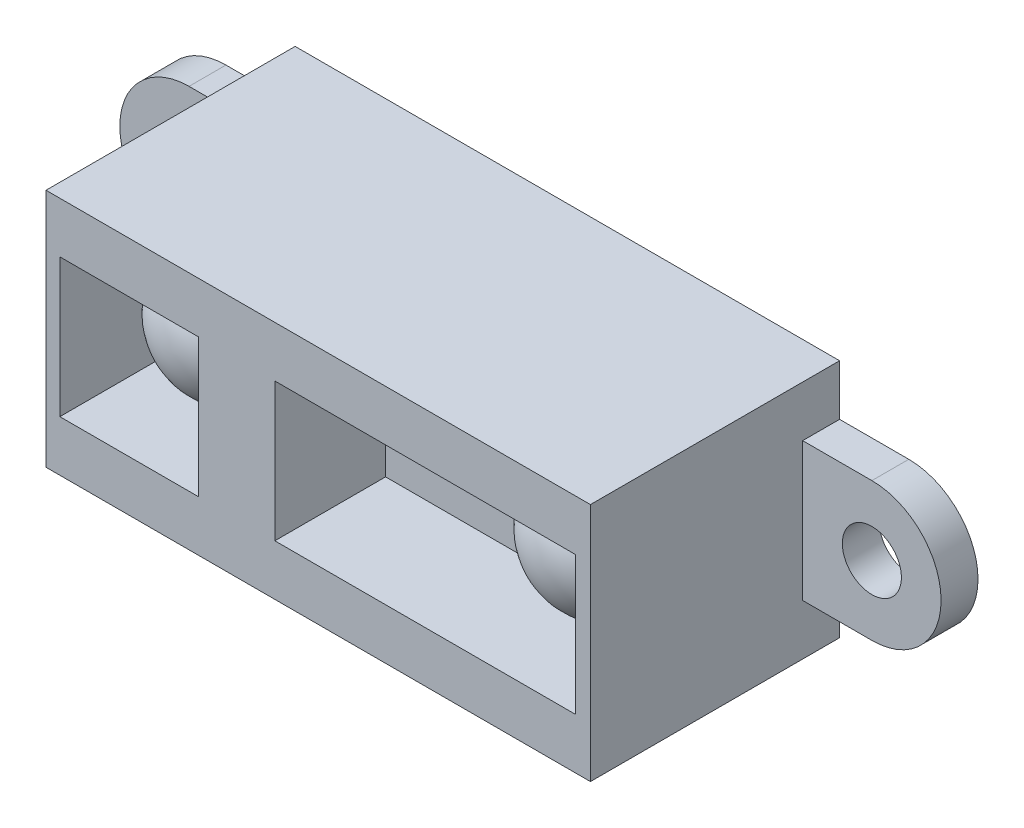
ISO-10303-21;
HEADER;
FILE_DESCRIPTION(('STEP AP214'),'2;1');
FILE_NAME('part.step','',(''),(''),'','','');
FILE_SCHEMA(('AUTOMOTIVE_DESIGN { 1 0 10303 214 1 1 1 1 }'));
ENDSEC;
DATA;
#1=APPLICATION_CONTEXT('core data for automotive mechanical design processes');
#2=APPLICATION_PROTOCOL_DEFINITION('international standard','automotive_design',2000,#1);
#3=PRODUCT_CONTEXT('',#1,'mechanical');
#4=PRODUCT('Part','Part','',(#3));
#5=PRODUCT_RELATED_PRODUCT_CATEGORY('part','',(#4));
#6=PRODUCT_DEFINITION_FORMATION('','',#4);
#7=PRODUCT_DEFINITION_CONTEXT('part definition',#1,'design');
#8=PRODUCT_DEFINITION('design','',#6,#7);
#9=PRODUCT_DEFINITION_SHAPE('','',#8);
#10=(LENGTH_UNIT() NAMED_UNIT(*) SI_UNIT(.MILLI.,.METRE.));
#11=(NAMED_UNIT(*) PLANE_ANGLE_UNIT() SI_UNIT($,.RADIAN.));
#12=(NAMED_UNIT(*) SI_UNIT($,.STERADIAN.) SOLID_ANGLE_UNIT());
#13=UNCERTAINTY_MEASURE_WITH_UNIT(LENGTH_MEASURE(1.E-05),#10,'distance_accuracy_value','');
#14=(GEOMETRIC_REPRESENTATION_CONTEXT(3) GLOBAL_UNCERTAINTY_ASSIGNED_CONTEXT((#13)) GLOBAL_UNIT_ASSIGNED_CONTEXT((#10,
#11,#12)) REPRESENTATION_CONTEXT('',''));
#15=CARTESIAN_POINT('',(0.,0.,0.));
#16=DIRECTION('',(0.,0.,1.));
#17=DIRECTION('',(1.,0.,0.));
#18=AXIS2_PLACEMENT_3D('',#15,#16,#17);
#19=CARTESIAN_POINT('',(-14.75,-6.49999999999998,13.5));
#20=DIRECTION('',(0.,1.,0.));
#21=DIRECTION('',(0.,0.,1.));
#22=AXIS2_PLACEMENT_3D('',#19,#20,#21);
#23=PLANE('',#22);
#24=DIRECTION('',(0.,0.,-1.));
#25=VECTOR('',#24,1.);
#26=CARTESIAN_POINT('',(-4.05000000000001,-6.49999999999998,0.));
#27=LINE('',#26,#25);
#28=CARTESIAN_POINT('',(-4.05000000000001,-6.49999999999998,3.3));
#29=VERTEX_POINT('',#28);
#30=CARTESIAN_POINT('',(-4.05000000000002,-6.49999999999998,0.));
#31=VERTEX_POINT('',#30);
#32=EDGE_CURVE('E39',#29,#31,#27,.T.);
#33=ORIENTED_EDGE('',*,*,#32,.F.);
#34=DIRECTION('',(-1.,0.,0.));
#35=VECTOR('',#34,1.);
#36=CARTESIAN_POINT('',(-4.05000000000001,-6.49999999999998,3.3));
#37=LINE('',#36,#35);
#38=CARTESIAN_POINT('',(6.04999999999999,-6.49999999999998,3.3));
#39=VERTEX_POINT('',#38);
#40=EDGE_CURVE('E236',#39,#29,#37,.T.);
#41=ORIENTED_EDGE('',*,*,#40,.F.);
#42=DIRECTION('',(0.,0.,1.));
#43=VECTOR('',#42,1.);
#44=CARTESIAN_POINT('',(6.04999999999999,-6.49999999999998,0.));
#45=LINE('',#44,#43);
#46=CARTESIAN_POINT('',(6.04999999999997,-6.49999999999998,0.));
#47=VERTEX_POINT('',#46);
#48=EDGE_CURVE('E58',#47,#39,#45,.T.);
#49=ORIENTED_EDGE('',*,*,#48,.F.);
#50=DIRECTION('',(1.,0.,0.));
#51=VECTOR('',#50,1.);
#52=CARTESIAN_POINT('',(-14.75,-6.49999999999998,0.));
#53=LINE('',#52,#51);
#54=CARTESIAN_POINT('',(14.75,-6.49999999999998,0.));
#55=VERTEX_POINT('',#54);
#56=EDGE_CURVE('E252',#47,#55,#53,.T.);
#57=ORIENTED_EDGE('',*,*,#56,.T.);
#58=DIRECTION('',(0.,0.,-1.));
#59=VECTOR('',#58,1.);
#60=CARTESIAN_POINT('',(14.75,-6.49999999999998,13.5));
#61=LINE('',#60,#59);
#62=CARTESIAN_POINT('',(14.75,-6.49999999999998,13.5));
#63=VERTEX_POINT('',#62);
#64=EDGE_CURVE('E261',#63,#55,#61,.T.);
#65=ORIENTED_EDGE('',*,*,#64,.F.);
#66=DIRECTION('',(1.,0.,0.));
#67=VECTOR('',#66,1.);
#68=CARTESIAN_POINT('',(-14.75,-6.49999999999998,13.5));
#69=LINE('',#68,#67);
#70=CARTESIAN_POINT('',(-14.75,-6.49999999999998,13.5));
#71=VERTEX_POINT('',#70);
#72=EDGE_CURVE('E266',#71,#63,#69,.T.);
#73=ORIENTED_EDGE('',*,*,#72,.F.);
#74=DIRECTION('',(0.,0.,-1.));
#75=VECTOR('',#74,1.);
#76=CARTESIAN_POINT('',(-14.75,-6.49999999999998,13.5));
#77=LINE('',#76,#75);
#78=CARTESIAN_POINT('',(-14.75,-6.49999999999998,0.));
#79=VERTEX_POINT('',#78);
#80=EDGE_CURVE('E265',#71,#79,#77,.T.);
#81=ORIENTED_EDGE('',*,*,#80,.T.);
#82=EDGE_CURVE('E255',#79,#31,#53,.T.);
#83=ORIENTED_EDGE('',*,*,#82,.T.);
#84=EDGE_LOOP('',(#33,#41,#49,#57,#65,#73,#81,#83));
#85=FACE_BOUND('',#84,.T.);
#86=ADVANCED_FACE('F35',(#85),#23,.F.);
#87=CARTESIAN_POINT('',(0.,0.,7.5));
#88=DIRECTION('',(0.,0.,1.));
#89=DIRECTION('',(1.,0.,0.));
#90=AXIS2_PLACEMENT_3D('',#87,#88,#89);
#91=PLANE('',#90);
#92=CARTESIAN_POINT('',(9.90283427935879,0.,7.5));
#93=DIRECTION('',(0.,0.,1.));
#94=DIRECTION('',(1.,0.,0.));
#95=AXIS2_PLACEMENT_3D('',#92,#93,#94);
#96=CIRCLE('',#95,3.75);
#97=CARTESIAN_POINT('',(9.90283427935879,3.75000000000001,7.5));
#98=VERTEX_POINT('',#97);
#99=CARTESIAN_POINT('',(9.90283427935879,-3.74999999999999,7.5));
#100=VERTEX_POINT('',#99);
#101=EDGE_CURVE('E11',#98,#100,#96,.T.);
#102=ORIENTED_EDGE('',*,*,#101,.F.);
#103=DIRECTION('',(-1.,0.,0.));
#104=VECTOR('',#103,1.);
#105=CARTESIAN_POINT('',(-2.35000000000001,3.75000000000001,7.5));
#106=LINE('',#105,#104);
#107=CARTESIAN_POINT('',(-2.35000000000001,3.75000000000001,7.5));
#108=VERTEX_POINT('',#107);
#109=EDGE_CURVE('E553',#98,#108,#106,.T.);
#110=ORIENTED_EDGE('',*,*,#109,.T.);
#111=DIRECTION('',(0.,-1.,0.));
#112=VECTOR('',#111,1.);
#113=CARTESIAN_POINT('',(-2.35000000000001,3.75000000000001,7.5));
#114=LINE('',#113,#112);
#115=CARTESIAN_POINT('',(-2.35000000000001,-3.74999999999999,7.5));
#116=VERTEX_POINT('',#115);
#117=EDGE_CURVE('E542',#108,#116,#114,.T.);
#118=ORIENTED_EDGE('',*,*,#117,.T.);
#119=DIRECTION('',(1.,0.,0.));
#120=VECTOR('',#119,1.);
#121=CARTESIAN_POINT('',(-2.35000000000001,-3.74999999999999,7.5));
#122=LINE('',#121,#120);
#123=EDGE_CURVE('E547',#116,#100,#122,.T.);
#124=ORIENTED_EDGE('',*,*,#123,.T.);
#125=EDGE_LOOP('',(#102,#110,#118,#124));
#126=FACE_BOUND('',#125,.T.);
#127=ADVANCED_FACE('F461',(#126),#91,.T.);
#128=CARTESIAN_POINT('',(0.,0.,7.5));
#129=DIRECTION('',(0.,0.,1.));
#130=DIRECTION('',(1.,0.,0.));
#131=AXIS2_PLACEMENT_3D('',#128,#129,#130);
#132=PLANE('',#131);
#133=CARTESIAN_POINT('',(-10.25,0.,7.5));
#134=DIRECTION('',(0.,0.,1.));
#135=DIRECTION('',(1.,0.,0.));
#136=AXIS2_PLACEMENT_3D('',#133,#134,#135);
#137=CIRCLE('',#136,3.75);
#138=CARTESIAN_POINT('',(-6.50000000000001,0.,7.5));
#139=VERTEX_POINT('',#138);
#140=CARTESIAN_POINT('',(-10.25,3.75000000000001,7.5));
#141=VERTEX_POINT('',#140);
#142=EDGE_CURVE('E281',#139,#141,#137,.T.);
#143=ORIENTED_EDGE('',*,*,#142,.F.);
#144=DIRECTION('',(0.,1.,0.));
#145=VECTOR('',#144,1.);
#146=CARTESIAN_POINT('',(-6.50000000000001,3.75000000000001,7.5));
#147=LINE('',#146,#145);
#148=CARTESIAN_POINT('',(-6.50000000000001,3.75000000000001,7.5));
#149=VERTEX_POINT('',#148);
#150=EDGE_CURVE('E319',#139,#149,#147,.T.);
#151=ORIENTED_EDGE('',*,*,#150,.T.);
#152=DIRECTION('',(-1.,0.,0.));
#153=VECTOR('',#152,1.);
#154=CARTESIAN_POINT('',(-14.,3.75000000000001,7.5));
#155=LINE('',#154,#153);
#156=EDGE_CURVE('E322',#149,#141,#155,.T.);
#157=ORIENTED_EDGE('',*,*,#156,.T.);
#158=EDGE_LOOP('',(#143,#151,#157));
#159=FACE_BOUND('',#158,.T.);
#160=ADVANCED_FACE('F468',(#159),#132,.T.);
#161=CARTESIAN_POINT('',(-14.,0.,7.5));
#162=VERTEX_POINT('',#161);
#163=EDGE_CURVE('E285',#141,#162,#137,.T.);
#164=ORIENTED_EDGE('',*,*,#163,.F.);
#165=CARTESIAN_POINT('',(-14.,3.75000000000001,7.5));
#166=VERTEX_POINT('',#165);
#167=EDGE_CURVE('E311',#141,#166,#155,.T.);
#168=ORIENTED_EDGE('',*,*,#167,.T.);
#169=DIRECTION('',(0.,-1.,0.));
#170=VECTOR('',#169,1.);
#171=CARTESIAN_POINT('',(-14.,3.75000000000001,7.5));
#172=LINE('',#171,#170);
#173=EDGE_CURVE('E303',#166,#162,#172,.T.);
#174=ORIENTED_EDGE('',*,*,#173,.T.);
#175=EDGE_LOOP('',(#164,#168,#174));
#176=FACE_BOUND('',#175,.T.);
#177=ADVANCED_FACE('F309',(#176),#132,.T.);
#178=CARTESIAN_POINT('',(-10.25,-3.74999999999999,7.5));
#179=VERTEX_POINT('',#178);
#180=EDGE_CURVE('E280',#162,#179,#137,.T.);
#181=ORIENTED_EDGE('',*,*,#180,.F.);
#182=CARTESIAN_POINT('',(-14.,-3.74999999999999,7.5));
#183=VERTEX_POINT('',#182);
#184=EDGE_CURVE('E295',#162,#183,#172,.T.);
#185=ORIENTED_EDGE('',*,*,#184,.T.);
#186=DIRECTION('',(1.,0.,0.));
#187=VECTOR('',#186,1.);
#188=CARTESIAN_POINT('',(-14.,-3.74999999999999,7.5));
#189=LINE('',#188,#187);
#190=EDGE_CURVE('E298',#183,#179,#189,.T.);
#191=ORIENTED_EDGE('',*,*,#190,.T.);
#192=EDGE_LOOP('',(#181,#185,#191));
#193=FACE_BOUND('',#192,.T.);
#194=ADVANCED_FACE('F294',(#193),#132,.T.);
#195=CARTESIAN_POINT('',(14.75,-6.49999999999998,13.5));
#196=DIRECTION('',(-1.,0.,0.));
#197=DIRECTION('',(0.,0.,1.));
#198=AXIS2_PLACEMENT_3D('',#195,#196,#197);
#199=PLANE('',#198);
#200=DIRECTION('',(0.,1.,0.));
#201=VECTOR('',#200,1.);
#202=CARTESIAN_POINT('',(14.75,-6.49999999999998,0.));
#203=LINE('',#202,#201);
#204=CARTESIAN_POINT('',(14.75,-3.75,0.));
#205=VERTEX_POINT('',#204);
#206=EDGE_CURVE('E416',#55,#205,#203,.T.);
#207=ORIENTED_EDGE('',*,*,#206,.T.);
#208=DIRECTION('',(0.,0.,1.));
#209=VECTOR('',#208,1.);
#210=CARTESIAN_POINT('',(14.75,-3.75,13.5));
#211=LINE('',#210,#209);
#212=CARTESIAN_POINT('',(14.75,-3.75000000000001,2.));
#213=VERTEX_POINT('',#212);
#214=EDGE_CURVE('E402',#205,#213,#211,.T.);
#215=ORIENTED_EDGE('',*,*,#214,.T.);
#216=DIRECTION('',(0.,-1.,0.));
#217=VECTOR('',#216,1.);
#218=CARTESIAN_POINT('',(14.75,-6.49999999999998,2.));
#219=LINE('',#218,#217);
#220=CARTESIAN_POINT('',(14.75,3.75,2.));
#221=VERTEX_POINT('',#220);
#222=EDGE_CURVE('E404',#221,#213,#219,.T.);
#223=ORIENTED_EDGE('',*,*,#222,.F.);
#224=DIRECTION('',(0.,0.,1.));
#225=VECTOR('',#224,1.);
#226=CARTESIAN_POINT('',(14.75,3.75,13.5));
#227=LINE('',#226,#225);
#228=CARTESIAN_POINT('',(14.75,3.75,0.));
#229=VERTEX_POINT('',#228);
#230=EDGE_CURVE('E396',#229,#221,#227,.T.);
#231=ORIENTED_EDGE('',*,*,#230,.F.);
#232=CARTESIAN_POINT('',(14.75,6.50000000000001,0.));
#233=VERTEX_POINT('',#232);
#234=EDGE_CURVE('E407',#229,#233,#203,.T.);
#235=ORIENTED_EDGE('',*,*,#234,.T.);
#236=DIRECTION('',(0.,0.,-1.));
#237=VECTOR('',#236,1.);
#238=CARTESIAN_POINT('',(14.75,6.50000000000001,13.5));
#239=LINE('',#238,#237);
#240=CARTESIAN_POINT('',(14.75,6.50000000000001,13.5));
#241=VERTEX_POINT('',#240);
#242=EDGE_CURVE('E272',#241,#233,#239,.T.);
#243=ORIENTED_EDGE('',*,*,#242,.F.);
#244=DIRECTION('',(0.,1.,0.));
#245=VECTOR('',#244,1.);
#246=CARTESIAN_POINT('',(14.75,-6.49999999999998,13.5));
#247=LINE('',#246,#245);
#248=EDGE_CURVE('E408',#63,#241,#247,.T.);
#249=ORIENTED_EDGE('',*,*,#248,.F.);
#250=ORIENTED_EDGE('',*,*,#64,.T.);
#251=EDGE_LOOP('',(#207,#215,#223,#231,#235,#243,#249,#250));
#252=FACE_BOUND('',#251,.T.);
#253=ADVANCED_FACE('F37',(#252),#199,.F.);
#254=CARTESIAN_POINT('',(-14.75,6.50000000000001,13.5));
#255=DIRECTION('',(0.,-1.,0.));
#256=DIRECTION('',(0.,0.,-1.));
#257=AXIS2_PLACEMENT_3D('',#254,#255,#256);
#258=PLANE('',#257);
#259=DIRECTION('',(-1.,0.,0.));
#260=VECTOR('',#259,1.);
#261=CARTESIAN_POINT('',(-14.75,6.50000000000001,0.));
#262=LINE('',#261,#260);
#263=CARTESIAN_POINT('',(-14.75,6.50000000000001,0.));
#264=VERTEX_POINT('',#263);
#265=EDGE_CURVE('E417',#233,#264,#262,.T.);
#266=ORIENTED_EDGE('',*,*,#265,.T.);
#267=DIRECTION('',(0.,0.,-1.));
#268=VECTOR('',#267,1.);
#269=CARTESIAN_POINT('',(-14.75,6.50000000000001,13.5));
#270=LINE('',#269,#268);
#271=CARTESIAN_POINT('',(-14.75,6.50000000000001,13.5));
#272=VERTEX_POINT('',#271);
#273=EDGE_CURVE('E269',#272,#264,#270,.T.);
#274=ORIENTED_EDGE('',*,*,#273,.F.);
#275=DIRECTION('',(-1.,0.,0.));
#276=VECTOR('',#275,1.);
#277=CARTESIAN_POINT('',(-14.75,6.50000000000001,13.5));
#278=LINE('',#277,#276);
#279=EDGE_CURVE('E411',#241,#272,#278,.T.);
#280=ORIENTED_EDGE('',*,*,#279,.F.);
#281=ORIENTED_EDGE('',*,*,#242,.T.);
#282=EDGE_LOOP('',(#266,#274,#280,#281));
#283=FACE_BOUND('',#282,.T.);
#284=ADVANCED_FACE('F477',(#283),#258,.F.);
#285=CARTESIAN_POINT('',(-14.75,-6.49999999999998,13.5));
#286=DIRECTION('',(1.,0.,0.));
#287=DIRECTION('',(0.,0.,-1.));
#288=AXIS2_PLACEMENT_3D('',#285,#286,#287);
#289=PLANE('',#288);
#290=DIRECTION('',(0.,1.,0.));
#291=VECTOR('',#290,1.);
#292=CARTESIAN_POINT('',(-14.75,-6.49999999999998,2.));
#293=LINE('',#292,#291);
#294=CARTESIAN_POINT('',(-14.75,-3.75000000000001,2.));
#295=VERTEX_POINT('',#294);
#296=CARTESIAN_POINT('',(-14.75,3.75,2.));
#297=VERTEX_POINT('',#296);
#298=EDGE_CURVE('E275',#295,#297,#293,.T.);
#299=ORIENTED_EDGE('',*,*,#298,.F.);
#300=DIRECTION('',(0.,0.,-1.));
#301=VECTOR('',#300,1.);
#302=CARTESIAN_POINT('',(-14.75,-3.75,13.5));
#303=LINE('',#302,#301);
#304=CARTESIAN_POINT('',(-14.75,-3.75,0.));
#305=VERTEX_POINT('',#304);
#306=EDGE_CURVE('E399',#295,#305,#303,.T.);
#307=ORIENTED_EDGE('',*,*,#306,.T.);
#308=DIRECTION('',(0.,-1.,0.));
#309=VECTOR('',#308,1.);
#310=CARTESIAN_POINT('',(-14.75,-6.49999999999998,0.));
#311=LINE('',#310,#309);
#312=EDGE_CURVE('E418',#305,#79,#311,.T.);
#313=ORIENTED_EDGE('',*,*,#312,.T.);
#314=ORIENTED_EDGE('',*,*,#80,.F.);
#315=DIRECTION('',(0.,-1.,0.));
#316=VECTOR('',#315,1.);
#317=CARTESIAN_POINT('',(-14.75,-6.49999999999998,13.5));
#318=LINE('',#317,#316);
#319=EDGE_CURVE('E413',#272,#71,#318,.T.);
#320=ORIENTED_EDGE('',*,*,#319,.F.);
#321=ORIENTED_EDGE('',*,*,#273,.T.);
#322=CARTESIAN_POINT('',(-14.75,3.75,0.));
#323=VERTEX_POINT('',#322);
#324=EDGE_CURVE('E256',#264,#323,#311,.T.);
#325=ORIENTED_EDGE('',*,*,#324,.T.);
#326=DIRECTION('',(0.,0.,-1.));
#327=VECTOR('',#326,1.);
#328=CARTESIAN_POINT('',(-14.75,3.75,13.5));
#329=LINE('',#328,#327);
#330=EDGE_CURVE('E387',#297,#323,#329,.T.);
#331=ORIENTED_EDGE('',*,*,#330,.F.);
#332=EDGE_LOOP('',(#299,#307,#313,#314,#320,#321,#325,#331));
#333=FACE_BOUND('',#332,.T.);
#334=ADVANCED_FACE('F425',(#333),#289,.F.);
#335=CARTESIAN_POINT('',(0.,0.,13.5));
#336=DIRECTION('',(0.,0.,-1.));
#337=DIRECTION('',(-1.,0.,0.));
#338=AXIS2_PLACEMENT_3D('',#335,#336,#337);
#339=PLANE('',#338);
#340=DIRECTION('',(1.,0.,0.));
#341=VECTOR('',#340,1.);
#342=CARTESIAN_POINT('',(-2.35000000000001,-3.74999999999999,13.5));
#343=LINE('',#342,#341);
#344=CARTESIAN_POINT('',(-2.35000000000001,-3.74999999999999,13.5));
#345=VERTEX_POINT('',#344);
#346=CARTESIAN_POINT('',(13.95,-3.74999999999999,13.5));
#347=VERTEX_POINT('',#346);
#348=EDGE_CURVE('E241',#345,#347,#343,.T.);
#349=ORIENTED_EDGE('',*,*,#348,.F.);
#350=DIRECTION('',(0.,-1.,0.));
#351=VECTOR('',#350,1.);
#352=CARTESIAN_POINT('',(-2.35000000000001,3.75000000000001,13.5));
#353=LINE('',#352,#351);
#354=CARTESIAN_POINT('',(-2.35000000000001,3.75000000000001,13.5));
#355=VERTEX_POINT('',#354);
#356=EDGE_CURVE('E239',#355,#345,#353,.T.);
#357=ORIENTED_EDGE('',*,*,#356,.F.);
#358=DIRECTION('',(-1.,0.,0.));
#359=VECTOR('',#358,1.);
#360=CARTESIAN_POINT('',(-2.35000000000001,3.75000000000001,13.5));
#361=LINE('',#360,#359);
#362=CARTESIAN_POINT('',(13.95,3.75000000000001,13.5));
#363=VERTEX_POINT('',#362);
#364=EDGE_CURVE('E546',#363,#355,#361,.T.);
#365=ORIENTED_EDGE('',*,*,#364,.F.);
#366=DIRECTION('',(0.,1.,0.));
#367=VECTOR('',#366,1.);
#368=CARTESIAN_POINT('',(13.95,3.75000000000001,13.5));
#369=LINE('',#368,#367);
#370=EDGE_CURVE('E557',#347,#363,#369,.T.);
#371=ORIENTED_EDGE('',*,*,#370,.F.);
#372=EDGE_LOOP('',(#349,#357,#365,#371));
#373=FACE_BOUND('',#372,.T.);
#374=DIRECTION('',(1.,0.,0.));
#375=VECTOR('',#374,1.);
#376=CARTESIAN_POINT('',(-14.,-3.74999999999999,13.5));
#377=LINE('',#376,#375);
#378=CARTESIAN_POINT('',(-14.,-3.74999999999999,13.5));
#379=VERTEX_POINT('',#378);
#380=CARTESIAN_POINT('',(-6.50000000000001,-3.74999999999999,13.5));
#381=VERTEX_POINT('',#380);
#382=EDGE_CURVE('E327',#379,#381,#377,.T.);
#383=ORIENTED_EDGE('',*,*,#382,.F.);
#384=DIRECTION('',(0.,-1.,0.));
#385=VECTOR('',#384,1.);
#386=CARTESIAN_POINT('',(-14.,3.75000000000001,13.5));
#387=LINE('',#386,#385);
#388=CARTESIAN_POINT('',(-14.,3.75000000000001,13.5));
#389=VERTEX_POINT('',#388);
#390=EDGE_CURVE('E325',#389,#379,#387,.T.);
#391=ORIENTED_EDGE('',*,*,#390,.F.);
#392=DIRECTION('',(-1.,0.,0.));
#393=VECTOR('',#392,1.);
#394=CARTESIAN_POINT('',(-14.,3.75000000000001,13.5));
#395=LINE('',#394,#393);
#396=CARTESIAN_POINT('',(-6.50000000000001,3.75000000000001,13.5));
#397=VERTEX_POINT('',#396);
#398=EDGE_CURVE('E306',#397,#389,#395,.T.);
#399=ORIENTED_EDGE('',*,*,#398,.F.);
#400=DIRECTION('',(0.,1.,0.));
#401=VECTOR('',#400,1.);
#402=CARTESIAN_POINT('',(-6.50000000000001,3.75000000000001,13.5));
#403=LINE('',#402,#401);
#404=EDGE_CURVE('E331',#381,#397,#403,.T.);
#405=ORIENTED_EDGE('',*,*,#404,.F.);
#406=EDGE_LOOP('',(#383,#391,#399,#405));
#407=FACE_BOUND('',#406,.T.);
#408=ORIENTED_EDGE('',*,*,#248,.T.);
#409=ORIENTED_EDGE('',*,*,#279,.T.);
#410=ORIENTED_EDGE('',*,*,#319,.T.);
#411=ORIENTED_EDGE('',*,*,#72,.T.);
#412=EDGE_LOOP('',(#408,#409,#410,#411));
#413=FACE_BOUND('',#412,.T.);
#414=ADVANCED_FACE('F476',(#373,#407,#413),#339,.F.);
#415=CARTESIAN_POINT('',(0.,0.,0.));
#416=DIRECTION('',(0.,0.,-1.));
#417=DIRECTION('',(-1.,0.,0.));
#418=AXIS2_PLACEMENT_3D('',#415,#416,#417);
#419=PLANE('',#418);
#420=ORIENTED_EDGE('',*,*,#312,.F.);
#421=DIRECTION('',(-1.,0.,0.));
#422=VECTOR('',#421,1.);
#423=CARTESIAN_POINT('',(0.,-3.75,0.));
#424=LINE('',#423,#422);
#425=CARTESIAN_POINT('',(-18.5,-3.75,0.));
#426=VERTEX_POINT('',#425);
#427=EDGE_CURVE('E378',#305,#426,#424,.T.);
#428=ORIENTED_EDGE('',*,*,#427,.T.);
#429=CARTESIAN_POINT('',(-18.5,0.,0.));
#430=DIRECTION('',(0.,0.,-1.));
#431=DIRECTION('',(-1.,0.,0.));
#432=AXIS2_PLACEMENT_3D('',#429,#430,#431);
#433=CIRCLE('',#432,3.75);
#434=CARTESIAN_POINT('',(-18.5,3.75,0.));
#435=VERTEX_POINT('',#434);
#436=EDGE_CURVE('E368',#426,#435,#433,.T.);
#437=ORIENTED_EDGE('',*,*,#436,.T.);
#438=DIRECTION('',(-1.,0.,0.));
#439=VECTOR('',#438,1.);
#440=CARTESIAN_POINT('',(0.,3.75,0.));
#441=LINE('',#440,#439);
#442=EDGE_CURVE('E371',#323,#435,#441,.T.);
#443=ORIENTED_EDGE('',*,*,#442,.F.);
#444=ORIENTED_EDGE('',*,*,#324,.F.);
#445=ORIENTED_EDGE('',*,*,#265,.F.);
#446=ORIENTED_EDGE('',*,*,#234,.F.);
#447=CARTESIAN_POINT('',(18.5,3.75,0.));
#448=VERTEX_POINT('',#447);
#449=EDGE_CURVE('E372',#448,#229,#441,.T.);
#450=ORIENTED_EDGE('',*,*,#449,.F.);
#451=CARTESIAN_POINT('',(18.5,0.,0.));
#452=DIRECTION('',(0.,0.,-1.));
#453=DIRECTION('',(-1.,0.,0.));
#454=AXIS2_PLACEMENT_3D('',#451,#452,#453);
#455=CIRCLE('',#454,3.75);
#456=CARTESIAN_POINT('',(18.5,-3.75,0.));
#457=VERTEX_POINT('',#456);
#458=EDGE_CURVE('E375',#448,#457,#455,.T.);
#459=ORIENTED_EDGE('',*,*,#458,.T.);
#460=EDGE_CURVE('E379',#457,#205,#424,.T.);
#461=ORIENTED_EDGE('',*,*,#460,.T.);
#462=ORIENTED_EDGE('',*,*,#206,.F.);
#463=ORIENTED_EDGE('',*,*,#56,.F.);
#464=DIRECTION('',(0.,1.,0.));
#465=VECTOR('',#464,1.);
#466=CARTESIAN_POINT('',(6.04999999999999,-12.5,0.));
#467=LINE('',#466,#465);
#468=CARTESIAN_POINT('',(6.04999999999999,-12.5,0.));
#469=VERTEX_POINT('',#468);
#470=EDGE_CURVE('E223',#469,#47,#467,.T.);
#471=ORIENTED_EDGE('',*,*,#470,.F.);
#472=DIRECTION('',(1.,0.,0.));
#473=VECTOR('',#472,1.);
#474=CARTESIAN_POINT('',(-4.05000000000001,-12.5,0.));
#475=LINE('',#474,#473);
#476=CARTESIAN_POINT('',(-4.05000000000001,-12.5,0.));
#477=VERTEX_POINT('',#476);
#478=EDGE_CURVE('E215',#477,#469,#475,.T.);
#479=ORIENTED_EDGE('',*,*,#478,.F.);
#480=DIRECTION('',(0.,1.,0.));
#481=VECTOR('',#480,1.);
#482=CARTESIAN_POINT('',(-4.05000000000001,-12.5,0.));
#483=LINE('',#482,#481);
#484=EDGE_CURVE('E221',#477,#31,#483,.T.);
#485=ORIENTED_EDGE('',*,*,#484,.T.);
#486=ORIENTED_EDGE('',*,*,#82,.F.);
#487=EDGE_LOOP('',(#420,#428,#437,#443,#444,#445,#446,#450,#459,#461,#462,#463,#471,#479,#485,#486));
#488=FACE_BOUND('',#487,.T.);
#489=CARTESIAN_POINT('',(-18.5,0.,0.));
#490=DIRECTION('',(0.,0.,-1.));
#491=DIRECTION('',(-1.,0.,0.));
#492=AXIS2_PLACEMENT_3D('',#489,#490,#491);
#493=CIRCLE('',#492,1.6);
#494=CARTESIAN_POINT('',(-20.1,0.,0.));
#495=VERTEX_POINT('',#494);
#496=EDGE_CURVE('E348',#495,#495,#493,.T.);
#497=ORIENTED_EDGE('',*,*,#496,.F.);
#498=EDGE_LOOP('',(#497));
#499=FACE_BOUND('',#498,.T.);
#500=CARTESIAN_POINT('',(18.5,0.,0.));
#501=DIRECTION('',(0.,0.,-1.));
#502=DIRECTION('',(-1.,0.,0.));
#503=AXIS2_PLACEMENT_3D('',#500,#501,#502);
#504=CIRCLE('',#503,1.6);
#505=CARTESIAN_POINT('',(16.9,0.,0.));
#506=VERTEX_POINT('',#505);
#507=EDGE_CURVE('E338',#506,#506,#504,.T.);
#508=ORIENTED_EDGE('',*,*,#507,.F.);
#509=EDGE_LOOP('',(#508));
#510=FACE_BOUND('',#509,.T.);
#511=ADVANCED_FACE('F217',(#488,#499,#510),#419,.T.);
#512=CARTESIAN_POINT('',(-18.5,0.,2.));
#513=DIRECTION('',(0.,0.,-1.));
#514=DIRECTION('',(-1.,0.,0.));
#515=AXIS2_PLACEMENT_3D('',#512,#513,#514);
#516=CYLINDRICAL_SURFACE('',#515,3.75);
#517=ORIENTED_EDGE('',*,*,#436,.F.);
#518=DIRECTION('',(0.,0.,-1.));
#519=VECTOR('',#518,1.);
#520=CARTESIAN_POINT('',(-18.5,-3.75,2.));
#521=LINE('',#520,#519);
#522=CARTESIAN_POINT('',(-18.5,-3.75,2.));
#523=VERTEX_POINT('',#522);
#524=EDGE_CURVE('E384',#523,#426,#521,.T.);
#525=ORIENTED_EDGE('',*,*,#524,.F.);
#526=CARTESIAN_POINT('',(-18.5,0.,2.));
#527=DIRECTION('',(0.,0.,-1.));
#528=DIRECTION('',(-1.,0.,0.));
#529=AXIS2_PLACEMENT_3D('',#526,#527,#528);
#530=CIRCLE('',#529,3.75);
#531=CARTESIAN_POINT('',(-18.5,3.75,2.));
#532=VERTEX_POINT('',#531);
#533=EDGE_CURVE('E347',#523,#532,#530,.T.);
#534=ORIENTED_EDGE('',*,*,#533,.T.);
#535=DIRECTION('',(0.,0.,-1.));
#536=VECTOR('',#535,1.);
#537=CARTESIAN_POINT('',(-18.5,3.75,2.));
#538=LINE('',#537,#536);
#539=EDGE_CURVE('E365',#532,#435,#538,.T.);
#540=ORIENTED_EDGE('',*,*,#539,.T.);
#541=EDGE_LOOP('',(#517,#525,#534,#540));
#542=FACE_BOUND('',#541,.T.);
#543=ADVANCED_FACE('F436',(#542),#516,.T.);
#544=CARTESIAN_POINT('',(-18.5,0.,2.));
#545=DIRECTION('',(0.,0.,-1.));
#546=DIRECTION('',(-1.,0.,0.));
#547=AXIS2_PLACEMENT_3D('',#544,#545,#546);
#548=CYLINDRICAL_SURFACE('',#547,1.6);
#549=CARTESIAN_POINT('',(-18.5,0.,2.));
#550=DIRECTION('',(0.,0.,-1.));
#551=DIRECTION('',(-1.,0.,0.));
#552=AXIS2_PLACEMENT_3D('',#549,#550,#551);
#553=CIRCLE('',#552,1.6);
#554=CARTESIAN_POINT('',(-20.1,0.,2.));
#555=VERTEX_POINT('',#554);
#556=EDGE_CURVE('E362',#555,#555,#553,.T.);
#557=ORIENTED_EDGE('',*,*,#556,.F.);
#558=EDGE_LOOP('',(#557));
#559=FACE_BOUND('',#558,.T.);
#560=ORIENTED_EDGE('',*,*,#496,.T.);
#561=EDGE_LOOP('',(#560));
#562=FACE_BOUND('',#561,.T.);
#563=ADVANCED_FACE('F511',(#559,#562),#548,.F.);
#564=CARTESIAN_POINT('',(0.,0.,2.));
#565=DIRECTION('',(0.,0.,-1.));
#566=DIRECTION('',(-1.,0.,0.));
#567=AXIS2_PLACEMENT_3D('',#564,#565,#566);
#568=PLANE('',#567);
#569=ORIENTED_EDGE('',*,*,#556,.T.);
#570=EDGE_LOOP('',(#569));
#571=FACE_BOUND('',#570,.T.);
#572=DIRECTION('',(-1.,0.,0.));
#573=VECTOR('',#572,1.);
#574=CARTESIAN_POINT('',(0.,-3.75,2.));
#575=LINE('',#574,#573);
#576=EDGE_CURVE('E358',#295,#523,#575,.T.);
#577=ORIENTED_EDGE('',*,*,#576,.F.);
#578=ORIENTED_EDGE('',*,*,#298,.T.);
#579=DIRECTION('',(-1.,0.,0.));
#580=VECTOR('',#579,1.);
#581=CARTESIAN_POINT('',(0.,3.75,2.));
#582=LINE('',#581,#580);
#583=EDGE_CURVE('E351',#297,#532,#582,.T.);
#584=ORIENTED_EDGE('',*,*,#583,.T.);
#585=ORIENTED_EDGE('',*,*,#533,.F.);
#586=EDGE_LOOP('',(#577,#578,#584,#585));
#587=FACE_BOUND('',#586,.T.);
#588=ADVANCED_FACE('F440',(#571,#587),#568,.F.);
#589=CARTESIAN_POINT('',(0.,3.75,2.));
#590=DIRECTION('',(0.,-1.,0.));
#591=DIRECTION('',(0.,0.,-1.));
#592=AXIS2_PLACEMENT_3D('',#589,#590,#591);
#593=PLANE('',#592);
#594=ORIENTED_EDGE('',*,*,#583,.F.);
#595=ORIENTED_EDGE('',*,*,#330,.T.);
#596=ORIENTED_EDGE('',*,*,#442,.T.);
#597=ORIENTED_EDGE('',*,*,#539,.F.);
#598=EDGE_LOOP('',(#594,#595,#596,#597));
#599=FACE_BOUND('',#598,.T.);
#600=ADVANCED_FACE('F430',(#599),#593,.F.);
#601=CARTESIAN_POINT('',(0.,-3.75,2.));
#602=DIRECTION('',(0.,-1.,0.));
#603=DIRECTION('',(0.,0.,-1.));
#604=AXIS2_PLACEMENT_3D('',#601,#602,#603);
#605=PLANE('',#604);
#606=ORIENTED_EDGE('',*,*,#306,.F.);
#607=ORIENTED_EDGE('',*,*,#576,.T.);
#608=ORIENTED_EDGE('',*,*,#524,.T.);
#609=ORIENTED_EDGE('',*,*,#427,.F.);
#610=EDGE_LOOP('',(#606,#607,#608,#609));
#611=FACE_BOUND('',#610,.T.);
#612=ADVANCED_FACE('F443',(#611),#605,.T.);
#613=CARTESIAN_POINT('',(18.5,0.,2.));
#614=DIRECTION('',(0.,0.,-1.));
#615=DIRECTION('',(-1.,0.,0.));
#616=AXIS2_PLACEMENT_3D('',#613,#614,#615);
#617=CIRCLE('',#616,1.6);
#618=CARTESIAN_POINT('',(16.9,0.,2.));
#619=VERTEX_POINT('',#618);
#620=EDGE_CURVE('E344',#619,#619,#617,.T.);
#621=ORIENTED_EDGE('',*,*,#620,.T.);
#622=EDGE_LOOP('',(#621));
#623=FACE_BOUND('',#622,.T.);
#624=CARTESIAN_POINT('',(18.5,3.75,2.));
#625=VERTEX_POINT('',#624);
#626=EDGE_CURVE('E352',#625,#221,#582,.T.);
#627=ORIENTED_EDGE('',*,*,#626,.T.);
#628=ORIENTED_EDGE('',*,*,#222,.T.);
#629=CARTESIAN_POINT('',(18.5,-3.75,2.));
#630=VERTEX_POINT('',#629);
#631=EDGE_CURVE('E359',#630,#213,#575,.T.);
#632=ORIENTED_EDGE('',*,*,#631,.F.);
#633=CARTESIAN_POINT('',(18.5,0.,2.));
#634=DIRECTION('',(0.,0.,-1.));
#635=DIRECTION('',(-1.,0.,0.));
#636=AXIS2_PLACEMENT_3D('',#633,#634,#635);
#637=CIRCLE('',#636,3.75);
#638=EDGE_CURVE('E355',#625,#630,#637,.T.);
#639=ORIENTED_EDGE('',*,*,#638,.F.);
#640=EDGE_LOOP('',(#627,#628,#632,#639));
#641=FACE_BOUND('',#640,.T.);
#642=ADVANCED_FACE('F445',(#623,#641),#568,.F.);
#643=ORIENTED_EDGE('',*,*,#214,.F.);
#644=ORIENTED_EDGE('',*,*,#460,.F.);
#645=DIRECTION('',(0.,0.,-1.));
#646=VECTOR('',#645,1.);
#647=CARTESIAN_POINT('',(18.5,-3.75,2.));
#648=LINE('',#647,#646);
#649=EDGE_CURVE('E388',#630,#457,#648,.T.);
#650=ORIENTED_EDGE('',*,*,#649,.F.);
#651=ORIENTED_EDGE('',*,*,#631,.T.);
#652=EDGE_LOOP('',(#643,#644,#650,#651));
#653=FACE_BOUND('',#652,.T.);
#654=ADVANCED_FACE('F447',(#653),#605,.T.);
#655=ORIENTED_EDGE('',*,*,#449,.T.);
#656=ORIENTED_EDGE('',*,*,#230,.T.);
#657=ORIENTED_EDGE('',*,*,#626,.F.);
#658=DIRECTION('',(0.,0.,-1.));
#659=VECTOR('',#658,1.);
#660=CARTESIAN_POINT('',(18.5,3.75,2.));
#661=LINE('',#660,#659);
#662=EDGE_CURVE('E390',#625,#448,#661,.T.);
#663=ORIENTED_EDGE('',*,*,#662,.T.);
#664=EDGE_LOOP('',(#655,#656,#657,#663));
#665=FACE_BOUND('',#664,.T.);
#666=ADVANCED_FACE('F455',(#665),#593,.F.);
#667=CARTESIAN_POINT('',(18.5,0.,2.));
#668=DIRECTION('',(0.,0.,-1.));
#669=DIRECTION('',(-1.,0.,0.));
#670=AXIS2_PLACEMENT_3D('',#667,#668,#669);
#671=CYLINDRICAL_SURFACE('',#670,3.75);
#672=ORIENTED_EDGE('',*,*,#458,.F.);
#673=ORIENTED_EDGE('',*,*,#662,.F.);
#674=ORIENTED_EDGE('',*,*,#638,.T.);
#675=ORIENTED_EDGE('',*,*,#649,.T.);
#676=EDGE_LOOP('',(#672,#673,#674,#675));
#677=FACE_BOUND('',#676,.T.);
#678=ADVANCED_FACE('F497',(#677),#671,.T.);
#679=CARTESIAN_POINT('',(18.5,0.,2.));
#680=DIRECTION('',(0.,0.,-1.));
#681=DIRECTION('',(-1.,0.,0.));
#682=AXIS2_PLACEMENT_3D('',#679,#680,#681);
#683=CYLINDRICAL_SURFACE('',#682,1.6);
#684=ORIENTED_EDGE('',*,*,#620,.F.);
#685=EDGE_LOOP('',(#684));
#686=FACE_BOUND('',#685,.T.);
#687=ORIENTED_EDGE('',*,*,#507,.T.);
#688=EDGE_LOOP('',(#687));
#689=FACE_BOUND('',#688,.T.);
#690=ADVANCED_FACE('F507',(#686,#689),#683,.F.);
#691=CARTESIAN_POINT('',(-14.,3.75000000000001,7.5));
#692=DIRECTION('',(-1.,0.,0.));
#693=DIRECTION('',(0.,-1.,0.));
#694=AXIS2_PLACEMENT_3D('',#691,#692,#693);
#695=PLANE('',#694);
#696=ORIENTED_EDGE('',*,*,#390,.T.);
#697=DIRECTION('',(0.,0.,1.));
#698=VECTOR('',#697,1.);
#699=CARTESIAN_POINT('',(-14.,-3.74999999999999,7.5));
#700=LINE('',#699,#698);
#701=EDGE_CURVE('E305',#183,#379,#700,.T.);
#702=ORIENTED_EDGE('',*,*,#701,.F.);
#703=ORIENTED_EDGE('',*,*,#184,.F.);
#704=ORIENTED_EDGE('',*,*,#173,.F.);
#705=DIRECTION('',(0.,0.,1.));
#706=VECTOR('',#705,1.);
#707=CARTESIAN_POINT('',(-14.,3.75000000000001,7.5));
#708=LINE('',#707,#706);
#709=EDGE_CURVE('E336',#166,#389,#708,.T.);
#710=ORIENTED_EDGE('',*,*,#709,.T.);
#711=EDGE_LOOP('',(#696,#702,#703,#704,#710));
#712=FACE_BOUND('',#711,.T.);
#713=ADVANCED_FACE('F302',(#712),#695,.F.);
#714=CARTESIAN_POINT('',(-14.,3.75000000000001,7.5));
#715=DIRECTION('',(0.,1.,0.));
#716=DIRECTION('',(0.,0.,1.));
#717=AXIS2_PLACEMENT_3D('',#714,#715,#716);
#718=PLANE('',#717);
#719=ORIENTED_EDGE('',*,*,#398,.T.);
#720=ORIENTED_EDGE('',*,*,#709,.F.);
#721=ORIENTED_EDGE('',*,*,#167,.F.);
#722=ORIENTED_EDGE('',*,*,#156,.F.);
#723=DIRECTION('',(0.,0.,1.));
#724=VECTOR('',#723,1.);
#725=CARTESIAN_POINT('',(-6.50000000000001,3.75000000000001,7.5));
#726=LINE('',#725,#724);
#727=EDGE_CURVE('E339',#149,#397,#726,.T.);
#728=ORIENTED_EDGE('',*,*,#727,.T.);
#729=EDGE_LOOP('',(#719,#720,#721,#722,#728));
#730=FACE_BOUND('',#729,.T.);
#731=ADVANCED_FACE('F597',(#730),#718,.F.);
#732=CARTESIAN_POINT('',(-6.50000000000001,3.75000000000001,7.5));
#733=DIRECTION('',(1.,0.,0.));
#734=DIRECTION('',(0.,1.,0.));
#735=AXIS2_PLACEMENT_3D('',#732,#733,#734);
#736=PLANE('',#735);
#737=ORIENTED_EDGE('',*,*,#404,.T.);
#738=ORIENTED_EDGE('',*,*,#727,.F.);
#739=ORIENTED_EDGE('',*,*,#150,.F.);
#740=CARTESIAN_POINT('',(-6.50000000000001,-3.74999999999999,7.5));
#741=VERTEX_POINT('',#740);
#742=EDGE_CURVE('E320',#741,#139,#147,.T.);
#743=ORIENTED_EDGE('',*,*,#742,.F.);
#744=DIRECTION('',(0.,0.,1.));
#745=VECTOR('',#744,1.);
#746=CARTESIAN_POINT('',(-6.50000000000001,-3.74999999999999,7.5));
#747=LINE('',#746,#745);
#748=EDGE_CURVE('E341',#741,#381,#747,.T.);
#749=ORIENTED_EDGE('',*,*,#748,.T.);
#750=EDGE_LOOP('',(#737,#738,#739,#743,#749));
#751=FACE_BOUND('',#750,.T.);
#752=ADVANCED_FACE('F600',(#751),#736,.F.);
#753=CARTESIAN_POINT('',(-14.,-3.74999999999999,7.5));
#754=DIRECTION('',(0.,-1.,0.));
#755=DIRECTION('',(0.,0.,-1.));
#756=AXIS2_PLACEMENT_3D('',#753,#754,#755);
#757=PLANE('',#756);
#758=ORIENTED_EDGE('',*,*,#382,.T.);
#759=ORIENTED_EDGE('',*,*,#748,.F.);
#760=EDGE_CURVE('E313',#179,#741,#189,.T.);
#761=ORIENTED_EDGE('',*,*,#760,.F.);
#762=ORIENTED_EDGE('',*,*,#190,.F.);
#763=ORIENTED_EDGE('',*,*,#701,.T.);
#764=EDGE_LOOP('',(#758,#759,#761,#762,#763));
#765=FACE_BOUND('',#764,.T.);
#766=ADVANCED_FACE('F595',(#765),#757,.F.);
#767=EDGE_CURVE('E278',#179,#139,#137,.T.);
#768=ORIENTED_EDGE('',*,*,#767,.F.);
#769=ORIENTED_EDGE('',*,*,#760,.T.);
#770=ORIENTED_EDGE('',*,*,#742,.T.);
#771=EDGE_LOOP('',(#768,#769,#770));
#772=FACE_BOUND('',#771,.T.);
#773=ADVANCED_FACE('F487',(#772),#132,.T.);
#774=CARTESIAN_POINT('',(-2.35000000000001,3.75000000000001,7.5));
#775=DIRECTION('',(-1.,0.,0.));
#776=DIRECTION('',(0.,-1.,0.));
#777=AXIS2_PLACEMENT_3D('',#774,#775,#776);
#778=PLANE('',#777);
#779=ORIENTED_EDGE('',*,*,#356,.T.);
#780=DIRECTION('',(0.,0.,1.));
#781=VECTOR('',#780,1.);
#782=CARTESIAN_POINT('',(-2.35000000000001,-3.74999999999999,7.5));
#783=LINE('',#782,#781);
#784=EDGE_CURVE('E316',#116,#345,#783,.T.);
#785=ORIENTED_EDGE('',*,*,#784,.F.);
#786=ORIENTED_EDGE('',*,*,#117,.F.);
#787=DIRECTION('',(0.,0.,1.));
#788=VECTOR('',#787,1.);
#789=CARTESIAN_POINT('',(-2.35000000000001,3.75000000000001,7.5));
#790=LINE('',#789,#788);
#791=EDGE_CURVE('E328',#108,#355,#790,.T.);
#792=ORIENTED_EDGE('',*,*,#791,.T.);
#793=EDGE_LOOP('',(#779,#785,#786,#792));
#794=FACE_BOUND('',#793,.T.);
#795=ADVANCED_FACE('F575',(#794),#778,.F.);
#796=CARTESIAN_POINT('',(-2.35000000000001,3.75000000000001,7.5));
#797=DIRECTION('',(0.,1.,0.));
#798=DIRECTION('',(0.,0.,1.));
#799=AXIS2_PLACEMENT_3D('',#796,#797,#798);
#800=PLANE('',#799);
#801=ORIENTED_EDGE('',*,*,#364,.T.);
#802=ORIENTED_EDGE('',*,*,#791,.F.);
#803=ORIENTED_EDGE('',*,*,#109,.F.);
#804=CARTESIAN_POINT('',(13.95,3.75000000000001,7.5));
#805=VERTEX_POINT('',#804);
#806=EDGE_CURVE('E554',#805,#98,#106,.T.);
#807=ORIENTED_EDGE('',*,*,#806,.F.);
#808=DIRECTION('',(0.,0.,1.));
#809=VECTOR('',#808,1.);
#810=CARTESIAN_POINT('',(13.95,3.75000000000001,7.5));
#811=LINE('',#810,#809);
#812=EDGE_CURVE('E563',#805,#363,#811,.T.);
#813=ORIENTED_EDGE('',*,*,#812,.T.);
#814=EDGE_LOOP('',(#801,#802,#803,#807,#813));
#815=FACE_BOUND('',#814,.T.);
#816=ADVANCED_FACE('F579',(#815),#800,.F.);
#817=CARTESIAN_POINT('',(13.95,3.75000000000001,7.5));
#818=DIRECTION('',(1.,0.,0.));
#819=DIRECTION('',(0.,0.,-1.));
#820=AXIS2_PLACEMENT_3D('',#817,#818,#819);
#821=PLANE('',#820);
#822=ORIENTED_EDGE('',*,*,#370,.T.);
#823=ORIENTED_EDGE('',*,*,#812,.F.);
#824=DIRECTION('',(0.,1.,0.));
#825=VECTOR('',#824,1.);
#826=CARTESIAN_POINT('',(13.95,3.75000000000001,7.5));
#827=LINE('',#826,#825);
#828=CARTESIAN_POINT('',(13.95,-3.74999999999999,7.5));
#829=VERTEX_POINT('',#828);
#830=EDGE_CURVE('E550',#829,#805,#827,.T.);
#831=ORIENTED_EDGE('',*,*,#830,.F.);
#832=DIRECTION('',(0.,0.,1.));
#833=VECTOR('',#832,1.);
#834=CARTESIAN_POINT('',(13.95,-3.74999999999999,7.5));
#835=LINE('',#834,#833);
#836=EDGE_CURVE('E564',#829,#347,#835,.T.);
#837=ORIENTED_EDGE('',*,*,#836,.T.);
#838=EDGE_LOOP('',(#822,#823,#831,#837));
#839=FACE_BOUND('',#838,.T.);
#840=ADVANCED_FACE('F582',(#839),#821,.F.);
#841=CARTESIAN_POINT('',(-2.35000000000001,-3.74999999999999,7.5));
#842=DIRECTION('',(0.,-1.,0.));
#843=DIRECTION('',(0.,0.,-1.));
#844=AXIS2_PLACEMENT_3D('',#841,#842,#843);
#845=PLANE('',#844);
#846=ORIENTED_EDGE('',*,*,#348,.T.);
#847=ORIENTED_EDGE('',*,*,#836,.F.);
#848=EDGE_CURVE('E545',#100,#829,#122,.T.);
#849=ORIENTED_EDGE('',*,*,#848,.F.);
#850=ORIENTED_EDGE('',*,*,#123,.F.);
#851=ORIENTED_EDGE('',*,*,#784,.T.);
#852=EDGE_LOOP('',(#846,#847,#849,#850,#851));
#853=FACE_BOUND('',#852,.T.);
#854=ADVANCED_FACE('F571',(#853),#845,.F.);
#855=EDGE_CURVE('E45',#100,#98,#96,.T.);
#856=ORIENTED_EDGE('',*,*,#855,.F.);
#857=ORIENTED_EDGE('',*,*,#848,.T.);
#858=ORIENTED_EDGE('',*,*,#830,.T.);
#859=ORIENTED_EDGE('',*,*,#806,.T.);
#860=EDGE_LOOP('',(#856,#857,#858,#859));
#861=FACE_BOUND('',#860,.T.);
#862=ADVANCED_FACE('F471',(#861),#91,.T.);
#863=CARTESIAN_POINT('',(-10.25,0.,7.5));
#864=DIRECTION('',(0.,1.,0.));
#865=DIRECTION('',(1.,0.,0.));
#866=AXIS2_PLACEMENT_3D('',#863,#864,#865);
#867=SPHERICAL_SURFACE('',#866,3.75);
#868=CARTESIAN_POINT('',(-10.25,0.,7.5));
#869=DIRECTION('',(0.,0.,1.));
#870=DIRECTION('',(1.,0.,0.));
#871=AXIS2_PLACEMENT_3D('',#868,#869,#870);
#872=SPHERICAL_SURFACE('',#871,3.75);
#873=ORIENTED_EDGE('',*,*,#767,.T.);
#874=ORIENTED_EDGE('',*,*,#142,.T.);
#875=ORIENTED_EDGE('',*,*,#163,.T.);
#876=ORIENTED_EDGE('',*,*,#180,.T.);
#877=EDGE_LOOP('',(#873,#874,#875,#876));
#878=FACE_BOUND('',#877,.T.);
#879=ADVANCED_FACE('F290',(#878),#872,.T.);
#880=CARTESIAN_POINT('',(9.90283427935879,0.,7.5));
#881=DIRECTION('',(0.,-1.,0.));
#882=DIRECTION('',(-1.,0.,0.));
#883=AXIS2_PLACEMENT_3D('',#880,#881,#882);
#884=SPHERICAL_SURFACE('',#883,3.75);
#885=CARTESIAN_POINT('',(9.90283427935879,0.,7.5));
#886=DIRECTION('',(0.,0.,1.));
#887=DIRECTION('',(1.,0.,0.));
#888=AXIS2_PLACEMENT_3D('',#885,#886,#887);
#889=SPHERICAL_SURFACE('',#888,3.75);
#890=ORIENTED_EDGE('',*,*,#855,.T.);
#891=ORIENTED_EDGE('',*,*,#101,.T.);
#892=EDGE_LOOP('',(#890,#891));
#893=FACE_BOUND('',#892,.T.);
#894=ADVANCED_FACE('F740',(#893),#889,.T.);
#895=CARTESIAN_POINT('',(-4.05000000000001,-12.5,0.));
#896=DIRECTION('',(1.,0.,0.));
#897=DIRECTION('',(0.,0.,-1.));
#898=AXIS2_PLACEMENT_3D('',#895,#896,#897);
#899=PLANE('',#898);
#900=ORIENTED_EDGE('',*,*,#32,.T.);
#901=ORIENTED_EDGE('',*,*,#484,.F.);
#902=DIRECTION('',(0.,0.,-1.));
#903=VECTOR('',#902,1.);
#904=CARTESIAN_POINT('',(-4.05000000000001,-12.5,0.));
#905=LINE('',#904,#903);
#906=CARTESIAN_POINT('',(-4.05000000000001,-12.5,3.3));
#907=VERTEX_POINT('',#906);
#908=EDGE_CURVE('E227',#907,#477,#905,.T.);
#909=ORIENTED_EDGE('',*,*,#908,.F.);
#910=DIRECTION('',(0.,1.,0.));
#911=VECTOR('',#910,1.);
#912=CARTESIAN_POINT('',(-4.05000000000001,-12.5,3.3));
#913=LINE('',#912,#911);
#914=EDGE_CURVE('E535',#907,#29,#913,.T.);
#915=ORIENTED_EDGE('',*,*,#914,.T.);
#916=EDGE_LOOP('',(#900,#901,#909,#915));
#917=FACE_BOUND('',#916,.T.);
#918=ADVANCED_FACE('F238',(#917),#899,.F.);
#919=CARTESIAN_POINT('',(6.04999999999999,-12.5,0.));
#920=DIRECTION('',(-1.,0.,0.));
#921=DIRECTION('',(0.,0.,1.));
#922=AXIS2_PLACEMENT_3D('',#919,#920,#921);
#923=PLANE('',#922);
#924=ORIENTED_EDGE('',*,*,#48,.T.);
#925=DIRECTION('',(0.,1.,0.));
#926=VECTOR('',#925,1.);
#927=CARTESIAN_POINT('',(6.04999999999999,-12.5,3.3));
#928=LINE('',#927,#926);
#929=CARTESIAN_POINT('',(6.04999999999999,-12.5,3.3));
#930=VERTEX_POINT('',#929);
#931=EDGE_CURVE('E243',#930,#39,#928,.T.);
#932=ORIENTED_EDGE('',*,*,#931,.F.);
#933=DIRECTION('',(0.,0.,1.));
#934=VECTOR('',#933,1.);
#935=CARTESIAN_POINT('',(6.04999999999999,-12.5,0.));
#936=LINE('',#935,#934);
#937=EDGE_CURVE('E226',#469,#930,#936,.T.);
#938=ORIENTED_EDGE('',*,*,#937,.F.);
#939=ORIENTED_EDGE('',*,*,#470,.T.);
#940=EDGE_LOOP('',(#924,#932,#938,#939));
#941=FACE_BOUND('',#940,.T.);
#942=ADVANCED_FACE('F531',(#941),#923,.F.);
#943=CARTESIAN_POINT('',(-4.05000000000001,-12.5,3.3));
#944=DIRECTION('',(0.,0.,-1.));
#945=DIRECTION('',(-1.,0.,0.));
#946=AXIS2_PLACEMENT_3D('',#943,#944,#945);
#947=PLANE('',#946);
#948=ORIENTED_EDGE('',*,*,#40,.T.);
#949=ORIENTED_EDGE('',*,*,#914,.F.);
#950=DIRECTION('',(-1.,0.,0.));
#951=VECTOR('',#950,1.);
#952=CARTESIAN_POINT('',(-4.05000000000001,-12.5,3.3));
#953=LINE('',#952,#951);
#954=EDGE_CURVE('E232',#930,#907,#953,.T.);
#955=ORIENTED_EDGE('',*,*,#954,.F.);
#956=ORIENTED_EDGE('',*,*,#931,.T.);
#957=EDGE_LOOP('',(#948,#949,#955,#956));
#958=FACE_BOUND('',#957,.T.);
#959=ADVANCED_FACE('F791',(#958),#947,.F.);
#960=CARTESIAN_POINT('',(0.,-12.5,0.));
#961=DIRECTION('',(0.,1.,0.));
#962=DIRECTION('',(0.,0.,1.));
#963=AXIS2_PLACEMENT_3D('',#960,#961,#962);
#964=PLANE('',#963);
#965=ORIENTED_EDGE('',*,*,#908,.T.);
#966=ORIENTED_EDGE('',*,*,#478,.T.);
#967=ORIENTED_EDGE('',*,*,#937,.T.);
#968=ORIENTED_EDGE('',*,*,#954,.T.);
#969=EDGE_LOOP('',(#965,#966,#967,#968));
#970=FACE_BOUND('',#969,.T.);
#971=ADVANCED_FACE('F230',(#970),#964,.F.);
#972=CLOSED_SHELL('',(#86,#127,#160,#177,#194,#253,#284,#334,#414,#511,#543,#563,#588,#600,#612,
#642,#654,#666,#678,#690,#713,#731,#752,#766,#773,#795,#816,#840,#854,#862,#879,#894,#918,#942,
#959,#971));
#973=MANIFOLD_SOLID_BREP('B2',#972);
#974=ADVANCED_BREP_SHAPE_REPRESENTATION('',(#18,#973),#14);
#975=SHAPE_DEFINITION_REPRESENTATION(#9,#974);
ENDSEC;
END-ISO-10303-21;
